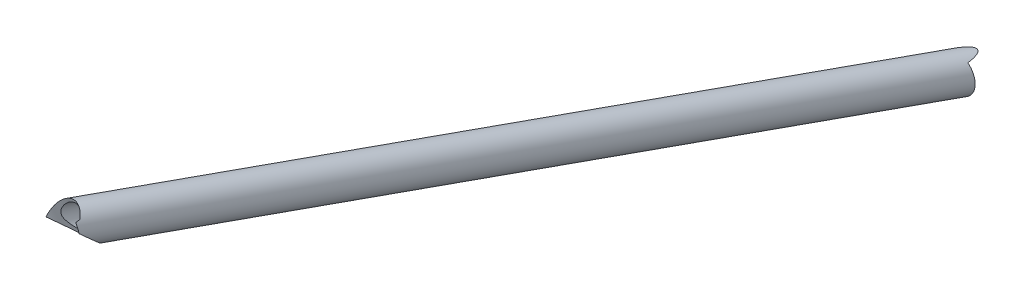
ISO-10303-21;
HEADER;
FILE_DESCRIPTION(('STEP AP214'),'2;1');
FILE_NAME('part.step','',(''),(''),'','','');
FILE_SCHEMA(('AUTOMOTIVE_DESIGN { 1 0 10303 214 1 1 1 1 }'));
ENDSEC;
DATA;
#1=APPLICATION_CONTEXT('core data for automotive mechanical design processes');
#2=APPLICATION_PROTOCOL_DEFINITION('international standard','automotive_design',2000,#1);
#3=PRODUCT_CONTEXT('',#1,'mechanical');
#4=PRODUCT('Part','Part','',(#3));
#5=PRODUCT_RELATED_PRODUCT_CATEGORY('part','',(#4));
#6=PRODUCT_DEFINITION_FORMATION('','',#4);
#7=PRODUCT_DEFINITION_CONTEXT('part definition',#1,'design');
#8=PRODUCT_DEFINITION('design','',#6,#7);
#9=PRODUCT_DEFINITION_SHAPE('','',#8);
#10=(LENGTH_UNIT() NAMED_UNIT(*) SI_UNIT(.MILLI.,.METRE.));
#11=(NAMED_UNIT(*) PLANE_ANGLE_UNIT() SI_UNIT($,.RADIAN.));
#12=(NAMED_UNIT(*) SI_UNIT($,.STERADIAN.) SOLID_ANGLE_UNIT());
#13=UNCERTAINTY_MEASURE_WITH_UNIT(LENGTH_MEASURE(1.E-05),#10,'distance_accuracy_value','');
#14=(GEOMETRIC_REPRESENTATION_CONTEXT(3) GLOBAL_UNCERTAINTY_ASSIGNED_CONTEXT((#13)) GLOBAL_UNIT_ASSIGNED_CONTEXT((#10,
#11,#12)) REPRESENTATION_CONTEXT('',''));
#15=CARTESIAN_POINT('',(0.,0.,0.));
#16=DIRECTION('',(0.,0.,1.));
#17=DIRECTION('',(1.,0.,0.));
#18=AXIS2_PLACEMENT_3D('',#15,#16,#17);
#19=CARTESIAN_POINT('',(-325.,320.000000000001,-1580.));
#20=DIRECTION('',(0.171152156864514,-0.228202875819352,-0.958452078441276));
#21=DIRECTION('',(0.,0.972806214685367,-0.23162052730604));
#22=AXIS2_PLACEMENT_3D('',#19,#20,#21);
#23=CYLINDRICAL_SURFACE('',#22,7.90000000000002);
#24=CARTESIAN_POINT('',(-323.966645789438,326.307363481933,-1587.61658574486));
#25=CARTESIAN_POINT('',(-324.175612977552,326.296705939445,-1587.66135152366));
#26=CARTESIAN_POINT('',(-324.385130251524,326.278194307405,-1587.70161499438));
#27=CARTESIAN_POINT('',(-324.803806167488,326.225592666959,-1587.77270181412));
#28=CARTESIAN_POINT('',(-325.012964831548,326.191503654472,-1587.80352576643));
#29=CARTESIAN_POINT('',(-325.429331243803,326.10800941774,-1587.85546586048));
#30=CARTESIAN_POINT('',(-325.636539738199,326.058610319406,-1587.87658587662));
#31=CARTESIAN_POINT('',(-326.047590361875,325.944851065945,-1587.90907319574));
#32=CARTESIAN_POINT('',(-326.251432413659,325.880490566915,-1587.9204402745));
#33=CARTESIAN_POINT('',(-326.654114025764,325.737328672348,-1587.93354626768));
#34=CARTESIAN_POINT('',(-326.852957366616,325.658538587954,-1587.9352926905));
#35=CARTESIAN_POINT('',(-327.244396967233,325.487029008777,-1587.92950186717));
#36=CARTESIAN_POINT('',(-327.43699324896,325.39430956297,-1587.92196465367));
#37=CARTESIAN_POINT('',(-327.814648256428,325.195520249693,-1587.89812019173));
#38=CARTESIAN_POINT('',(-327.999705415692,325.089447626241,-1587.88181113057));
#39=CARTESIAN_POINT('',(-328.360996222017,324.864592696472,-1587.84113024388));
#40=CARTESIAN_POINT('',(-328.537229771892,324.745810250208,-1587.81675832955));
#41=CARTESIAN_POINT('',(-328.883171108341,324.49363470297,-1587.76029145554));
#42=CARTESIAN_POINT('',(-329.052675275296,324.359995014687,-1587.72805048995));
#43=CARTESIAN_POINT('',(-329.380138189815,324.080751126029,-1587.6573038662));
#44=CARTESIAN_POINT('',(-329.538096290607,323.935146256374,-1587.61879785748));
#45=CARTESIAN_POINT('',(-329.841411766353,323.632473136907,-1587.53695436931));
#46=CARTESIAN_POINT('',(-329.986763322368,323.475399654367,-1587.49361467959));
#47=CARTESIAN_POINT('',(-330.263661653933,323.150348624936,-1587.40388851808));
#48=CARTESIAN_POINT('',(-330.395210073408,322.982372380405,-1587.35750241018));
#49=CARTESIAN_POINT('',(-330.627647246451,322.657865698544,-1587.2697847315));
#50=CARTESIAN_POINT('',(-330.73030935134,322.502575668911,-1587.22855610938));
#51=CARTESIAN_POINT('',(-330.92338273968,322.184285333026,-1587.14720228871));
#52=CARTESIAN_POINT('',(-331.013795796989,322.021286147807,-1587.10707693107));
#53=CARTESIAN_POINT('',(-331.181361251167,321.688116000308,-1587.03009063708));
#54=CARTESIAN_POINT('',(-331.258530440953,321.517954465975,-1586.99322559592));
#55=CARTESIAN_POINT('',(-331.398745391082,321.170803260723,-1586.92521090062));
#56=CARTESIAN_POINT('',(-331.461795592925,320.993815757686,-1586.89405944967));
#57=CARTESIAN_POINT('',(-331.559469854151,320.677103613812,-1586.84676427926));
#58=CARTESIAN_POINT('',(-331.597284526236,320.538629583804,-1586.82881302873));
#59=CARTESIAN_POINT('',(-331.663809412283,320.258867262343,-1586.7991638688));
#60=CARTESIAN_POINT('',(-331.692522238745,320.11757979083,-1586.78746416437));
#61=CARTESIAN_POINT('',(-331.740548139851,319.833230407488,-1586.77157067904));
#62=CARTESIAN_POINT('',(-331.759877165928,319.690171933827,-1586.76736412787));
#63=CARTESIAN_POINT('',(-331.789143741974,319.403088289108,-1586.76744607019));
#64=CARTESIAN_POINT('',(-331.799081421473,319.259063131411,-1586.7717344465));
#65=CARTESIAN_POINT('',(-331.809779255781,318.970823220959,-1586.78949122765));
#66=CARTESIAN_POINT('',(-331.810513222831,318.826609094364,-1586.80298571225));
#67=CARTESIAN_POINT('',(-331.803221828408,318.539605173904,-1586.83936643546));
#68=CARTESIAN_POINT('',(-331.795196490316,318.396815376239,-1586.86225264899));
#69=CARTESIAN_POINT('',(-331.771095616487,318.113555315602,-1586.91714650043));
#70=CARTESIAN_POINT('',(-331.755011834648,317.973087581172,-1586.94916346722));
#71=CARTESIAN_POINT('',(-331.715644776626,317.695355713712,-1587.0216286884));
#72=CARTESIAN_POINT('',(-331.692358975422,317.558092722442,-1587.0620798982));
#73=CARTESIAN_POINT('',(-331.627381771766,317.225349170742,-1587.17071740639));
#74=CARTESIAN_POINT('',(-331.582142543631,317.031937840523,-1587.24312942584));
#75=CARTESIAN_POINT('',(-331.480738834163,316.653416466328,-1587.40082231095));
#76=CARTESIAN_POINT('',(-331.424567929076,316.46831138242,-1587.48611073649));
#77=CARTESIAN_POINT('',(-331.303062809022,316.105524557629,-1587.6669629705));
#78=CARTESIAN_POINT('',(-331.237697980703,315.927870302184,-1587.76256084795));
#79=CARTESIAN_POINT('',(-331.099355498992,315.57992465588,-1587.96142327384));
#80=CARTESIAN_POINT('',(-331.026374644026,315.409636404384,-1588.06469104121));
#81=CARTESIAN_POINT('',(-330.869346515215,315.065978962611,-1588.28315551532));
#82=CARTESIAN_POINT('',(-330.784901583517,314.89301251358,-1588.39869665499));
#83=CARTESIAN_POINT('',(-330.609396325321,314.553782898399,-1588.63440289004));
#84=CARTESIAN_POINT('',(-330.518336737159,314.387518987316,-1588.75456746864));
#85=CARTESIAN_POINT('',(-330.32996054835,314.060812957099,-1588.9982980938));
#86=CARTESIAN_POINT('',(-330.232637111933,313.900377507749,-1589.12186776934));
#87=CARTESIAN_POINT('',(-330.032087887046,313.584992365595,-1589.3711879964));
#88=CARTESIAN_POINT('',(-329.92886202755,313.430042738839,-1589.49693857415));
#89=CARTESIAN_POINT('',(-329.716512415598,313.125089608449,-1589.74985250671));
#90=CARTESIAN_POINT('',(-329.607382739482,312.97509132514,-1589.87701717481));
#91=CARTESIAN_POINT('',(-329.383309350444,312.679940512797,-1590.13187726606));
#92=CARTESIAN_POINT('',(-329.268365139568,312.53478840056,-1590.2595727338));
#93=CARTESIAN_POINT('',(-329.032661263382,312.249314250809,-1590.51470753869));
#94=CARTESIAN_POINT('',(-328.911905950006,312.108988729665,-1590.64214699527));
#95=CARTESIAN_POINT('',(-328.664327364693,311.833041543755,-1590.89622315239));
#96=CARTESIAN_POINT('',(-328.537503991736,311.697419957366,-1591.02285983952));
#97=CARTESIAN_POINT('',(-328.218965991292,311.37092454144,-1591.33145518049));
#98=CARTESIAN_POINT('',(-328.023761106023,311.18268999951,-1591.51263017509));
#99=CARTESIAN_POINT('',(-327.619033451956,310.817000070191,-1591.86998291677));
#100=CARTESIAN_POINT('',(-327.409507647647,310.639546983229,-1592.04615959312));
#101=CARTESIAN_POINT('',(-326.975472741135,310.297301149023,-1592.39065031246));
#102=CARTESIAN_POINT('',(-326.751005438527,310.132475645247,-1592.55898422181));
#103=CARTESIAN_POINT('',(-326.285134459938,309.81718212593,-1592.8852884936));
#104=CARTESIAN_POINT('',(-326.043740629933,309.666705881852,-1593.04326477915));
#105=CARTESIAN_POINT('',(-325.648985875744,309.44365864803,-1593.28074583644));
#106=CARTESIAN_POINT('',(-325.501840267458,309.365169453411,-1593.36505341305));
#107=CARTESIAN_POINT('',(-325.201117663899,309.214899900372,-1593.52794402021));
#108=CARTESIAN_POINT('',(-325.047542373843,309.143117779284,-1593.60652855361));
#109=CARTESIAN_POINT('',(-324.73374174799,309.007324624022,-1593.75679221043));
#110=CARTESIAN_POINT('',(-324.573518518031,308.943311153846,-1593.82847349702));
#111=CARTESIAN_POINT('',(-324.246371289826,308.824371584971,-1593.96348645221));
#112=CARTESIAN_POINT('',(-324.079449130468,308.769443013342,-1594.026820392));
#113=CARTESIAN_POINT('',(-323.651473248592,308.644704220826,-1594.17344660598));
#114=CARTESIAN_POINT('',(-323.386076249317,308.581724607387,-1594.25029977602));
#115=CARTESIAN_POINT('',(-322.842989705136,308.486749593737,-1594.37377645335));
#116=CARTESIAN_POINT('',(-322.565322666786,308.454699741089,-1594.42045303906));
#117=CARTESIAN_POINT('',(-322.054925997664,308.430486618371,-1594.47125228855));
#118=CARTESIAN_POINT('',(-321.823132172701,308.432167732615,-1594.48153545433));
#119=CARTESIAN_POINT('',(-321.361846473169,308.463088898371,-1594.47403369806));
#120=CARTESIAN_POINT('',(-321.132353023235,308.492308571523,-1594.45626952431));
#121=CARTESIAN_POINT('',(-320.682460385865,308.578315843676,-1594.39226448898));
#122=CARTESIAN_POINT('',(-320.462070427092,308.635130707488,-1594.34599545164));
#123=CARTESIAN_POINT('',(-320.036634042802,308.773618622982,-1594.22746717292));
#124=CARTESIAN_POINT('',(-319.831599940047,308.855311377915,-1594.15518732275));
#125=CARTESIAN_POINT('',(-319.386800679416,309.064513183651,-1593.96613279026));
#126=CARTESIAN_POINT('',(-319.152971552989,309.198443485061,-1593.84258932957));
#127=CARTESIAN_POINT('',(-318.717551677071,309.490502310939,-1593.56996388295));
#128=CARTESIAN_POINT('',(-318.516027681318,309.648679652641,-1593.42083030176));
#129=CARTESIAN_POINT('',(-318.183055775347,309.946133438338,-1593.13891242488));
#130=CARTESIAN_POINT('',(-318.045833716883,310.082231557853,-1593.00943889128));
#131=CARTESIAN_POINT('',(-317.788227544251,310.362384426669,-1592.74245067169));
#132=CARTESIAN_POINT('',(-317.66785375529,310.506443980245,-1592.60493112737));
#133=CARTESIAN_POINT('',(-317.44213292526,310.800840149883,-1592.32387058368));
#134=CARTESIAN_POINT('',(-317.336811701037,310.951186991932,-1592.18031977281));
#135=CARTESIAN_POINT('',(-317.13979333432,311.256697896398,-1591.88898098236));
#136=CARTESIAN_POINT('',(-317.048101353315,311.411863757055,-1591.7411914227));
#137=CARTESIAN_POINT('',(-316.883534442454,311.714047712311,-1591.45407601125));
#138=CARTESIAN_POINT('',(-316.809757302507,311.860783278971,-1591.31496555731));
#139=CARTESIAN_POINT('',(-316.671732598033,312.157068565761,-1591.03498909851));
#140=CARTESIAN_POINT('',(-316.607486698353,312.306618772402,-1590.89412279159));
#141=CARTESIAN_POINT('',(-316.487702945425,312.608263239319,-1590.61120645477));
#142=CARTESIAN_POINT('',(-316.43217110821,312.76035917765,-1590.46915567778));
#143=CARTESIAN_POINT('',(-316.32920104256,313.066780031394,-1590.18451280989));
#144=CARTESIAN_POINT('',(-316.281763759283,313.221105204824,-1590.04192065778));
#145=CARTESIAN_POINT('',(-316.1505376836,313.687911826181,-1589.61344114924));
#146=CARTESIAN_POINT('',(-316.078092646999,314.003560342434,-1589.32747674906));
#147=CARTESIAN_POINT('',(-315.960137102148,314.642867596383,-1588.75940827293));
#148=CARTESIAN_POINT('',(-315.914613515388,314.966522364873,-1588.47730238768));
#149=CARTESIAN_POINT('',(-315.855278432126,315.556399920046,-1587.97751953436));
#150=CARTESIAN_POINT('',(-315.836904586015,315.820939564417,-1587.75839174109));
#151=CARTESIAN_POINT('',(-315.815730245234,316.357043138837,-1587.32788917604));
#152=CARTESIAN_POINT('',(-315.812935121075,316.628609458809,-1587.11651710286));
#153=CARTESIAN_POINT('',(-315.823269721577,317.179372946223,-1586.70605752242));
#154=CARTESIAN_POINT('',(-315.836347935387,317.458542572167,-1586.50693247072));
#155=CARTESIAN_POINT('',(-315.868820568357,317.884927696915,-1586.22132005617));
#156=CARTESIAN_POINT('',(-315.881781928044,318.028286824146,-1586.12831921839));
#157=CARTESIAN_POINT('',(-315.912279156258,318.317833934133,-1585.94764508389));
#158=CARTESIAN_POINT('',(-315.929814147619,318.464021369483,-1585.85997076958));
#159=CARTESIAN_POINT('',(-315.969407882145,318.756347019321,-1585.69289482091));
#160=CARTESIAN_POINT('',(-315.991363539988,318.902421388793,-1585.61335781653));
#161=CARTESIAN_POINT('',(-316.040458216635,319.197581159026,-1585.46188171627));
#162=CARTESIAN_POINT('',(-316.067595632317,319.346665615807,-1585.38994028115));
#163=CARTESIAN_POINT('',(-316.127568921345,319.647646092685,-1585.25529704515));
#164=CARTESIAN_POINT('',(-316.160397920218,319.799538525738,-1585.19258426464));
#165=CARTESIAN_POINT('',(-316.232396442554,320.105936917606,-1585.07807389028));
#166=CARTESIAN_POINT('',(-316.271564764243,320.260442376097,-1585.02627423185));
#167=CARTESIAN_POINT('',(-316.350438126196,320.547797036791,-1584.94224046715));
#168=CARTESIAN_POINT('',(-316.389168764805,320.680392888008,-1584.90823295765));
#169=CARTESIAN_POINT('',(-316.472011982754,320.946100486204,-1584.85033378193));
#170=CARTESIAN_POINT('',(-316.516123177735,321.079212091988,-1584.82643952073));
#171=CARTESIAN_POINT('',(-316.609962282551,321.34482622717,-1584.78944283766));
#172=CARTESIAN_POINT('',(-316.65968484098,321.477329213538,-1584.77633023089));
#173=CARTESIAN_POINT('',(-316.764931077916,321.740660079065,-1584.76108593662));
#174=CARTESIAN_POINT('',(-316.820454821703,321.871487939355,-1584.75895437269));
#175=CARTESIAN_POINT('',(-316.937309370941,322.130222679651,-1584.76538861047));
#176=CARTESIAN_POINT('',(-316.998639217347,322.258130037745,-1584.77395264834));
#177=CARTESIAN_POINT('',(-317.127016751926,322.509946879284,-1584.80101905618));
#178=CARTESIAN_POINT('',(-317.194064533294,322.633856297523,-1584.81952158817));
#179=CARTESIAN_POINT('',(-317.333827930134,322.877006619952,-1584.8654065194));
#180=CARTESIAN_POINT('',(-317.406553077724,322.996239144779,-1584.89280410775));
#181=CARTESIAN_POINT('',(-317.557379298019,323.229203629307,-1584.95519196755));
#182=CARTESIAN_POINT('',(-317.635481806636,323.34293410589,-1584.9901842724));
#183=CARTESIAN_POINT('',(-317.825936814212,323.604391915603,-1585.08018196015));
#184=CARTESIAN_POINT('',(-317.94049043809,323.749603869138,-1585.13785544733));
#185=CARTESIAN_POINT('',(-318.178681272476,324.028515561492,-1585.26167200673));
#186=CARTESIAN_POINT('',(-318.302321687874,324.162211202072,-1585.32781807338));
#187=CARTESIAN_POINT('',(-318.558351250161,324.417973241705,-1585.46590329899));
#188=CARTESIAN_POINT('',(-318.690748938686,324.540027994575,-1585.53784812932));
#189=CARTESIAN_POINT('',(-318.963750725273,324.772263892189,-1585.68515294859));
#190=CARTESIAN_POINT('',(-319.104354120499,324.882446051552,-1585.76051264491));
#191=CARTESIAN_POINT('',(-319.39693432789,325.093479941637,-1585.91460055078));
#192=CARTESIAN_POINT('',(-319.549106420037,325.194033531026,-1585.99336597534));
#193=CARTESIAN_POINT('',(-319.861145504985,325.382553673917,-1586.15070030944));
#194=CARTESIAN_POINT('',(-320.021012463064,325.47052028421,-1586.22926921987));
#195=CARTESIAN_POINT('',(-320.347889832587,325.633746036495,-1586.38471611423));
#196=CARTESIAN_POINT('',(-320.514899959196,325.709005684591,-1586.4615941654));
#197=CARTESIAN_POINT('',(-320.855439775351,325.846667157937,-1586.61237385235));
#198=CARTESIAN_POINT('',(-321.028969832076,325.909068257751,-1586.68627532001));
#199=CARTESIAN_POINT('',(-321.422312149553,326.033651136146,-1586.84645347296));
#200=CARTESIAN_POINT('',(-321.643616388932,326.092504629311,-1586.93168437677));
#201=CARTESIAN_POINT('',(-322.093506321028,326.190186091478,-1587.09414204081));
#202=CARTESIAN_POINT('',(-322.322093290177,326.229010529294,-1587.17136738772));
#203=CARTESIAN_POINT('',(-322.784783519137,326.286356406959,-1587.31628949338));
#204=CARTESIAN_POINT('',(-323.018886858958,326.304877552142,-1587.38398611382));
#205=CARTESIAN_POINT('',(-323.490637209322,326.321457776419,-1587.50860191757));
#206=CARTESIAN_POINT('',(-323.728283634655,326.31952019809,-1587.56552285987));
#207=CARTESIAN_POINT('',(-323.966645789438,326.307363481933,-1587.61658574486));
#208=B_SPLINE_CURVE_WITH_KNOTS('',3,(#24,#25,#26,#27,#28,#29,#30,#31,#32,#33,#34,#35,#36,#37,
#38,#39,#40,#41,#42,#43,#44,#45,#46,#47,#48,#49,#50,#51,#52,#53,#54,#55,#56,#57,#58,#59,#60,#61,
#62,#63,#64,#65,#66,#67,#68,#69,#70,#71,#72,#73,#74,#75,#76,#77,#78,#79,#80,#81,#82,#83,#84,#85,
#86,#87,#88,#89,#90,#91,#92,#93,#94,#95,#96,#97,#98,#99,#100,#101,#102,#103,#104,#105,#106,#107,
#108,#109,#110,#111,#112,#113,#114,#115,#116,#117,#118,#119,#120,#121,#122,#123,#124,#125,#126,
#127,#128,#129,#130,#131,#132,#133,#134,#135,#136,#137,#138,#139,#140,#141,#142,#143,#144,#145,
#146,#147,#148,#149,#150,#151,#152,#153,#154,#155,#156,#157,#158,#159,#160,#161,#162,#163,#164,
#165,#166,#167,#168,#169,#170,#171,#172,#173,#174,#175,#176,#177,#178,#179,#180,#181,#182,#183,
#184,#185,#186,#187,#188,#189,#190,#191,#192,#193,#194,#195,#196,#197,#198,#199,#200,#201,#202,
#203,#204,#205,#206,#207),.UNSPECIFIED.,.T.,.F.,(4,2,2,2,2,2,2,2,2,2,2,2,2,2,2,2,2,2,2,2,2,2,2,
2,2,2,2,2,2,2,2,2,2,2,2,2,2,2,2,2,2,2,2,2,2,2,2,2,2,2,2,2,2,2,2,2,2,2,2,2,2,2,2,2,2,2,2,2,2,2,2,
2,2,2,2,2,2,2,2,2,2,2,2,2,2,2,2,2,2,2,2,4),(0.,0.641704329611899,1.28336763838427,
1.92477453387002,2.5661961741722,3.20711714888526,3.84803587010683,4.48908708904818,
5.13014536727589,5.78414780113118,6.43818684201445,7.09252618571569,7.74678751032439,
8.31827836305474,8.88968636604467,9.46036439629941,10.0308626517851,10.4644506860705,
10.8979141547717,11.3306381803332,11.7633562374895,12.1973052494243,12.6312531030776,
13.0656459197607,13.500191207072,14.1333716373086,14.7669252713597,15.4026407395492,
16.0386245303214,16.7118211956781,17.3849428332674,18.0588119339345,18.732689145088,
19.4072555127852,20.0818797481702,20.7560063898021,21.4301442582081,22.408041529519,
23.3861467260691,24.3616221326295,25.3365347489841,25.8968804295847,26.4570784306394,
27.0171003151639,27.5769695087206,28.4241783998819,29.2698930277613,29.9629478102968,
30.6554901390051,31.3487181149286,32.0424965605374,32.9268983269329,33.8131046551531,
34.510040594884,35.2074017884904,35.9059450397208,36.6047521638569,37.2502009575918,
37.8957623611373,38.5417675061809,39.1878480301279,40.4828470291268,41.7772163962968,
42.8087527674546,43.8406447219922,44.8691969999012,45.3831866347857,45.8970777652997,
46.4001426450299,46.9030521389416,47.4053583817463,47.9075695114377,48.3339353794479,
48.7601917785987,49.1860450500361,49.6119031140239,50.0376909575122,50.4634857420237,
50.8900114680439,51.3166515337829,51.8970135845173,52.4775813191319,53.0587239231647,
53.6398168239457,54.2352807580677,54.830742005473,55.4261795307611,56.021650639454,
56.7536021247078,57.4856826112602,58.2177737224595,58.9497452253594),.UNSPECIFIED.);
#209=CARTESIAN_POINT('',(-323.966645789438,326.307363481933,-1587.61658574486));
#210=VERTEX_POINT('',#209);
#211=EDGE_CURVE('E91',#210,#210,#208,.T.);
#212=ORIENTED_EDGE('',*,*,#211,.T.);
#213=EDGE_LOOP('',(#212));
#214=FACE_BOUND('',#213,.T.);
#215=CARTESIAN_POINT('',(-257.5,230.,-1958.));
#216=DIRECTION('',(0.,-1.,0.));
#217=DIRECTION('',(0.175790638483658,0.,-0.984427575508482));
#218=AXIS2_PLACEMENT_3D('',#215,#216,#217);
#219=ELLIPSE('',#218,34.6183192110767,7.90000000000002);
#220=CARTESIAN_POINT('',(-254.867149858447,230.,-1990.));
#221=VERTEX_POINT('',#220);
#222=CARTESIAN_POINT('',(-249.317399497776,230.,-1990.));
#223=VERTEX_POINT('',#222);
#224=EDGE_CURVE('E80',#221,#223,#219,.T.);
#225=ORIENTED_EDGE('',*,*,#224,.T.);
#226=CARTESIAN_POINT('',(-251.785714285714,222.380952380953,-1990.));
#227=DIRECTION('',(0.,0.,-1.));
#228=DIRECTION('',(0.6,-0.8,0.));
#229=AXIS2_PLACEMENT_3D('',#226,#227,#228);
#230=ELLIPSE('',#229,8.24245695501827,7.90000000000002);
#231=EDGE_CURVE('E84',#223,#221,#230,.T.);
#232=ORIENTED_EDGE('',*,*,#231,.T.);
#233=EDGE_LOOP('',(#225,#232));
#234=FACE_BOUND('',#233,.T.);
#235=ADVANCED_FACE('F39',(#214,#234),#23,.F.);
#236=CARTESIAN_POINT('',(-250.,0.,-1700.));
#237=DIRECTION('',(-0.214351342090107,0.914565726251124,0.342962147344171));
#238=DIRECTION('',(0.,-0.351123441588391,0.936329177569045));
#239=AXIS2_PLACEMENT_3D('',#236,#237,#238);
#240=CYLINDRICAL_SURFACE('',#239,9.49999999999999);
#241=ORIENTED_EDGE('',*,*,#211,.F.);
#242=EDGE_LOOP('',(#241));
#243=FACE_BOUND('',#242,.T.);
#244=CARTESIAN_POINT('',(-325.,320.000000000001,-1580.));
#245=DIRECTION('',(0.217268286027578,-0.644059979147453,-0.733472041148959));
#246=DIRECTION('',(-0.046806891515563,0.743683273485426,-0.666891523146495));
#247=AXIS2_PLACEMENT_3D('',#244,#245,#246);
#248=ELLIPSE('',#247,10.7083267615423,9.49999999999999);
#249=CARTESIAN_POINT('',(-317.012417877543,325.183222265319,-1582.18530176604));
#250=VERTEX_POINT('',#249);
#251=CARTESIAN_POINT('',(-334.262395776099,318.297353717629,-1581.24860727374));
#252=VERTEX_POINT('',#251);
#253=EDGE_CURVE('E136',#250,#252,#248,.F.);
#254=ORIENTED_EDGE('',*,*,#253,.T.);
#255=CARTESIAN_POINT('',(-325.,320.000000000001,-1580.));
#256=DIRECTION('',(-0.046806891515563,0.743683273485426,-0.666891523146495));
#257=DIRECTION('',(0.217268286027578,-0.644059979147453,-0.733472041148959));
#258=AXIS2_PLACEMENT_3D('',#255,#256,#257);
#259=ELLIPSE('',#258,20.5867526008063,9.49999999999999);
#260=CARTESIAN_POINT('',(-315.362927698438,320.466468830435,-1580.15621180857));
#261=VERTEX_POINT('',#260);
#262=EDGE_CURVE('E138',#252,#261,#259,.F.);
#263=ORIENTED_EDGE('',*,*,#262,.T.);
#264=CARTESIAN_POINT('',(-325.,320.,-1580.));
#265=DIRECTION('',(-0.00416950723616265,0.393939167319852,0.919127057408686));
#266=DIRECTION('',(-0.2871987901008,0.87994037819309,-0.37844654284329));
#267=AXIS2_PLACEMENT_3D('',#264,#265,#266);
#268=ELLIPSE('',#267,14.0448859001954,9.49999999999999);
#269=EDGE_CURVE('E139',#261,#250,#268,.T.);
#270=ORIENTED_EDGE('',*,*,#269,.T.);
#271=EDGE_LOOP('',(#254,#263,#270));
#272=FACE_BOUND('',#271,.T.);
#273=ADVANCED_FACE('F41',(#243,#272),#240,.F.);
#274=CARTESIAN_POINT('',(-325.,320.,-1580.));
#275=DIRECTION('',(0.208710809439999,-0.381642622975999,0.900438063583998));
#276=DIRECTION('',(0.,-0.920714591276893,-0.390236647958419));
#277=AXIS2_PLACEMENT_3D('',#274,#275,#276);
#278=CYLINDRICAL_SURFACE('',#277,9.49999999999999);
#279=CARTESIAN_POINT('',(-325.,320.,-1580.));
#280=DIRECTION('',(0.526991553913357,-0.846050959333568,-0.0804840127897105));
#281=DIRECTION('',(-0.020132316108703,0.0822472927426935,-0.996408587219418));
#282=AXIS2_PLACEMENT_3D('',#279,#280,#281);
#283=ELLIPSE('',#282,26.3590831761343,9.49999999999999);
#284=CARTESIAN_POINT('',(-316.933254371061,325.021925002937,-1579.97139372722));
#285=VERTEX_POINT('',#284);
#286=EDGE_CURVE('E94',#285,#250,#283,.F.);
#287=ORIENTED_EDGE('',*,*,#286,.T.);
#288=ORIENTED_EDGE('',*,*,#269,.F.);
#289=CARTESIAN_POINT('',(-325.,320.,-1580.));
#290=DIRECTION('',(-0.020132316108703,0.0822472927426935,-0.996408587219418));
#291=DIRECTION('',(0.526991553913357,-0.846050959333568,-0.0804840127897105));
#292=AXIS2_PLACEMENT_3D('',#289,#290,#291);
#293=ELLIPSE('',#292,10.1844443246886,9.49999999999999);
#294=CARTESIAN_POINT('',(-316.270280458692,323.778315288412,-1579.86450665722));
#295=VERTEX_POINT('',#294);
#296=EDGE_CURVE('E144',#261,#295,#293,.F.);
#297=ORIENTED_EDGE('',*,*,#296,.T.);
#298=CARTESIAN_POINT('',(-316.270280458692,323.778315288412,-1579.86450665722));
#299=CARTESIAN_POINT('',(-316.294979951848,323.831618025316,-1579.86900844477));
#300=CARTESIAN_POINT('',(-316.320051972187,323.884749293451,-1579.87349656047));
#301=CARTESIAN_POINT('',(-316.370936017966,323.990658120329,-1579.88245118407));
#302=CARTESIAN_POINT('',(-316.396748043406,324.043435679071,-1579.88691769197));
#303=CARTESIAN_POINT('',(-316.449107050118,324.148626315303,-1579.8958348359));
#304=CARTESIAN_POINT('',(-316.475654031392,324.201039392792,-1579.90028547192));
#305=CARTESIAN_POINT('',(-316.529477658469,324.305490413791,-1579.9091766136));
#306=CARTESIAN_POINT('',(-316.556754304273,324.357528357301,-1579.91361711926));
#307=CARTESIAN_POINT('',(-316.61203179476,324.461218547676,-1579.922493744));
#308=CARTESIAN_POINT('',(-316.640032639442,324.512870794541,-1579.92692986307));
#309=CARTESIAN_POINT('',(-316.696752867186,324.615779132736,-1579.93580345957));
#310=CARTESIAN_POINT('',(-316.725472250246,324.667035224065,-1579.94024093699));
#311=CARTESIAN_POINT('',(-316.783623722202,324.769140886717,-1579.94912299499));
#312=CARTESIAN_POINT('',(-316.813055811097,324.819990458039,-1579.95356757556));
#313=CARTESIAN_POINT('',(-316.872626628213,324.921272850585,-1579.96246958195));
#314=CARTESIAN_POINT('',(-316.902765356433,324.971705671809,-1579.96692700776));
#315=CARTESIAN_POINT('',(-316.933254371061,325.021925002937,-1579.97139372722));
#316=B_SPLINE_CURVE_WITH_KNOTS('',3,(#298,#299,#300,#301,#302,#303,#304,#305,#306,#307,#308,
#309,#310,#311,#312,#313,#314,#315),.UNSPECIFIED.,.F.,.F.,(4,2,2,2,2,2,2,2,4),(0.,
0.176757206024485,0.353514412048936,0.530271618073425,0.707028824097875,0.883786030122375,
1.06054323614685,1.23730044217133,1.4140576481958),.UNSPECIFIED.);
#317=EDGE_CURVE('E130',#295,#285,#316,.T.);
#318=ORIENTED_EDGE('',*,*,#317,.T.);
#319=EDGE_LOOP('',(#287,#288,#297,#318));
#320=FACE_BOUND('',#319,.T.);
#321=ADVANCED_FACE('F111',(#320),#278,.F.);
#322=CARTESIAN_POINT('',(-325.,320.000000000001,-1580.));
#323=DIRECTION('',(0.171152156864514,-0.228202875819352,-0.958452078441276));
#324=DIRECTION('',(0.,0.972806214685367,-0.23162052730604));
#325=AXIS2_PLACEMENT_3D('',#322,#323,#324);
#326=CYLINDRICAL_SURFACE('',#325,9.49999999999999);
#327=ORIENTED_EDGE('',*,*,#286,.F.);
#328=ORIENTED_EDGE('',*,*,#317,.F.);
#329=ORIENTED_EDGE('',*,*,#296,.F.);
#330=ORIENTED_EDGE('',*,*,#262,.F.);
#331=ORIENTED_EDGE('',*,*,#253,.F.);
#332=EDGE_LOOP('',(#327,#328,#329,#330,#331));
#333=FACE_BOUND('',#332,.T.);
#334=CARTESIAN_POINT('',(-251.785714285714,222.380952380953,-1990.));
#335=DIRECTION('',(0.,0.,-1.));
#336=DIRECTION('',(0.6,-0.8,0.));
#337=AXIS2_PLACEMENT_3D('',#334,#335,#336);
#338=ELLIPSE('',#337,9.91181532565485,9.49999999999999);
#339=CARTESIAN_POINT('',(-246.060686079591,230.,-1990.));
#340=VERTEX_POINT('',#339);
#341=CARTESIAN_POINT('',(-258.123863276632,230.,-1990.));
#342=VERTEX_POINT('',#341);
#343=EDGE_CURVE('E11',#340,#342,#338,.T.);
#344=ORIENTED_EDGE('',*,*,#343,.F.);
#345=CARTESIAN_POINT('',(-257.5,230.,-1958.));
#346=DIRECTION('',(0.,-1.,0.));
#347=DIRECTION('',(0.175790638483658,0.,-0.984427575508482));
#348=AXIS2_PLACEMENT_3D('',#345,#346,#347);
#349=ELLIPSE('',#348,41.6296243677503,9.49999999999999);
#350=EDGE_CURVE('E48',#342,#340,#349,.T.);
#351=ORIENTED_EDGE('',*,*,#350,.F.);
#352=EDGE_LOOP('',(#344,#351));
#353=FACE_BOUND('',#352,.T.);
#354=ADVANCED_FACE('F102',(#333,#353),#326,.T.);
#355=CARTESIAN_POINT('',(-250.,230.,-1990.));
#356=DIRECTION('',(0.,-1.,0.));
#357=DIRECTION('',(0.,0.,-1.));
#358=AXIS2_PLACEMENT_3D('',#355,#356,#357);
#359=PLANE('',#358);
#360=DIRECTION('',(1.,0.,0.));
#361=VECTOR('',#360,1.);
#362=CARTESIAN_POINT('',(-250.,230.,-1990.));
#363=LINE('',#362,#361);
#364=EDGE_CURVE('E60',#342,#221,#363,.T.);
#365=ORIENTED_EDGE('',*,*,#364,.F.);
#366=ORIENTED_EDGE('',*,*,#350,.T.);
#367=EDGE_CURVE('E55',#223,#340,#363,.T.);
#368=ORIENTED_EDGE('',*,*,#367,.F.);
#369=ORIENTED_EDGE('',*,*,#224,.F.);
#370=EDGE_LOOP('',(#365,#366,#368,#369));
#371=FACE_BOUND('',#370,.T.);
#372=ADVANCED_FACE('F81',(#371),#359,.T.);
#373=CARTESIAN_POINT('',(-250.,210.,-1990.));
#374=DIRECTION('',(0.,0.,-1.));
#375=DIRECTION('',(-1.,0.,0.));
#376=AXIS2_PLACEMENT_3D('',#373,#374,#375);
#377=PLANE('',#376);
#378=ORIENTED_EDGE('',*,*,#367,.T.);
#379=ORIENTED_EDGE('',*,*,#343,.T.);
#380=ORIENTED_EDGE('',*,*,#364,.T.);
#381=ORIENTED_EDGE('',*,*,#231,.F.);
#382=EDGE_LOOP('',(#378,#379,#380,#381));
#383=FACE_BOUND('',#382,.T.);
#384=ADVANCED_FACE('F87',(#383),#377,.T.);
#385=CLOSED_SHELL('',(#235,#273,#321,#354,#372,#384));
#386=MANIFOLD_SOLID_BREP('B2',#385);
#387=ADVANCED_BREP_SHAPE_REPRESENTATION('',(#18,#386),#14);
#388=SHAPE_DEFINITION_REPRESENTATION(#9,#387);
ENDSEC;
END-ISO-10303-21;
